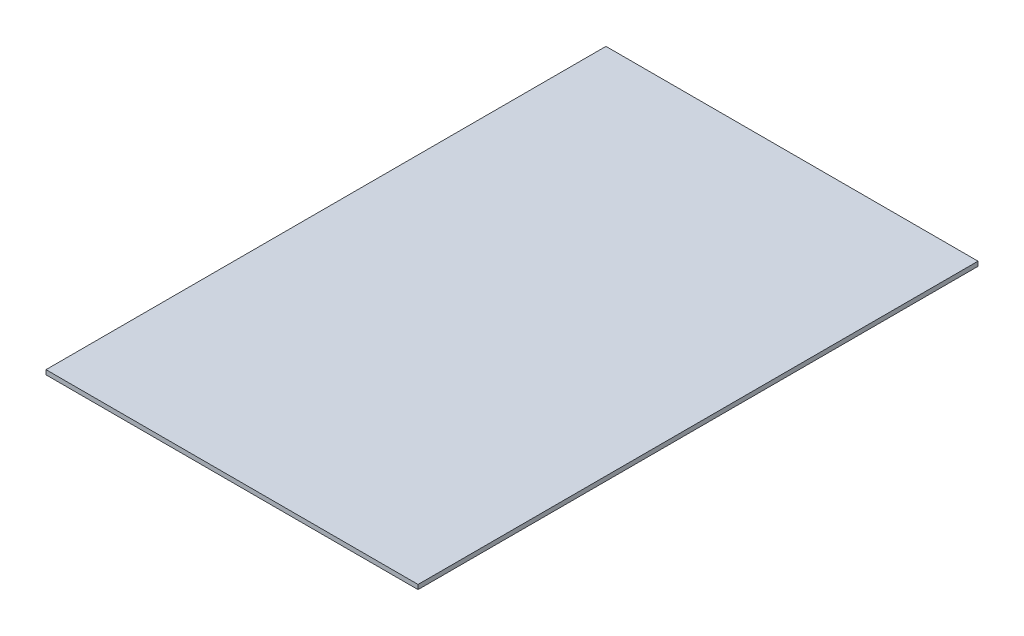
ISO-10303-21;
HEADER;
FILE_DESCRIPTION(('STEP AP214'),'2;1');
FILE_NAME('part.step','',(''),(''),'','','');
FILE_SCHEMA(('AUTOMOTIVE_DESIGN { 1 0 10303 214 1 1 1 1 }'));
ENDSEC;
DATA;
#1=APPLICATION_CONTEXT('core data for automotive mechanical design processes');
#2=APPLICATION_PROTOCOL_DEFINITION('international standard','automotive_design',2000,#1);
#3=PRODUCT_CONTEXT('',#1,'mechanical');
#4=PRODUCT('Part','Part','',(#3));
#5=PRODUCT_RELATED_PRODUCT_CATEGORY('part','',(#4));
#6=PRODUCT_DEFINITION_FORMATION('','',#4);
#7=PRODUCT_DEFINITION_CONTEXT('part definition',#1,'design');
#8=PRODUCT_DEFINITION('design','',#6,#7);
#9=PRODUCT_DEFINITION_SHAPE('','',#8);
#10=(LENGTH_UNIT() NAMED_UNIT(*) SI_UNIT(.MILLI.,.METRE.));
#11=(NAMED_UNIT(*) PLANE_ANGLE_UNIT() SI_UNIT($,.RADIAN.));
#12=(NAMED_UNIT(*) SI_UNIT($,.STERADIAN.) SOLID_ANGLE_UNIT());
#13=UNCERTAINTY_MEASURE_WITH_UNIT(LENGTH_MEASURE(1.E-05),#10,'distance_accuracy_value','');
#14=(GEOMETRIC_REPRESENTATION_CONTEXT(3) GLOBAL_UNCERTAINTY_ASSIGNED_CONTEXT((#13)) GLOBAL_UNIT_ASSIGNED_CONTEXT((#10,
#11,#12)) REPRESENTATION_CONTEXT('',''));
#15=CARTESIAN_POINT('',(0.,0.,0.));
#16=DIRECTION('',(0.,0.,1.));
#17=DIRECTION('',(1.,0.,0.));
#18=AXIS2_PLACEMENT_3D('',#15,#16,#17);
#19=CARTESIAN_POINT('',(99.,2.4,-149.));
#20=DIRECTION('',(-1.,0.,0.));
#21=DIRECTION('',(0.,0.,1.));
#22=AXIS2_PLACEMENT_3D('',#19,#20,#21);
#23=PLANE('',#22);
#24=DIRECTION('',(0.,0.,-1.));
#25=VECTOR('',#24,1.);
#26=CARTESIAN_POINT('',(99.,0.,-149.));
#27=LINE('',#26,#25);
#28=CARTESIAN_POINT('',(99.,0.,149.));
#29=VERTEX_POINT('',#28);
#30=CARTESIAN_POINT('',(99.,0.,-149.));
#31=VERTEX_POINT('',#30);
#32=EDGE_CURVE('E96',#29,#31,#27,.T.);
#33=ORIENTED_EDGE('',*,*,#32,.T.);
#34=DIRECTION('',(0.,-1.,0.));
#35=VECTOR('',#34,1.);
#36=CARTESIAN_POINT('',(99.,2.4,-149.));
#37=LINE('',#36,#35);
#38=CARTESIAN_POINT('',(99.,2.4,-149.));
#39=VERTEX_POINT('',#38);
#40=EDGE_CURVE('E11',#39,#31,#37,.T.);
#41=ORIENTED_EDGE('',*,*,#40,.F.);
#42=DIRECTION('',(0.,0.,-1.));
#43=VECTOR('',#42,1.);
#44=CARTESIAN_POINT('',(99.,2.4,-149.));
#45=LINE('',#44,#43);
#46=CARTESIAN_POINT('',(99.,2.4,149.));
#47=VERTEX_POINT('',#46);
#48=EDGE_CURVE('E84',#47,#39,#45,.T.);
#49=ORIENTED_EDGE('',*,*,#48,.F.);
#50=DIRECTION('',(0.,-1.,0.));
#51=VECTOR('',#50,1.);
#52=CARTESIAN_POINT('',(99.,2.4,149.));
#53=LINE('',#52,#51);
#54=EDGE_CURVE('E92',#47,#29,#53,.T.);
#55=ORIENTED_EDGE('',*,*,#54,.T.);
#56=EDGE_LOOP('',(#33,#41,#49,#55));
#57=FACE_BOUND('',#56,.T.);
#58=ADVANCED_FACE('F33',(#57),#23,.F.);
#59=CARTESIAN_POINT('',(-99.,2.4,-149.));
#60=DIRECTION('',(0.,0.,1.));
#61=DIRECTION('',(1.,0.,0.));
#62=AXIS2_PLACEMENT_3D('',#59,#60,#61);
#63=PLANE('',#62);
#64=DIRECTION('',(-1.,0.,0.));
#65=VECTOR('',#64,1.);
#66=CARTESIAN_POINT('',(-99.,0.,-149.));
#67=LINE('',#66,#65);
#68=CARTESIAN_POINT('',(-99.,0.,-149.));
#69=VERTEX_POINT('',#68);
#70=EDGE_CURVE('E88',#31,#69,#67,.T.);
#71=ORIENTED_EDGE('',*,*,#70,.T.);
#72=DIRECTION('',(0.,-1.,0.));
#73=VECTOR('',#72,1.);
#74=CARTESIAN_POINT('',(-99.,2.4,-149.));
#75=LINE('',#74,#73);
#76=CARTESIAN_POINT('',(-99.,2.4,-149.));
#77=VERTEX_POINT('',#76);
#78=EDGE_CURVE('E41',#77,#69,#75,.T.);
#79=ORIENTED_EDGE('',*,*,#78,.F.);
#80=DIRECTION('',(-1.,0.,0.));
#81=VECTOR('',#80,1.);
#82=CARTESIAN_POINT('',(-99.,2.4,-149.));
#83=LINE('',#82,#81);
#84=EDGE_CURVE('E79',#39,#77,#83,.T.);
#85=ORIENTED_EDGE('',*,*,#84,.F.);
#86=ORIENTED_EDGE('',*,*,#40,.T.);
#87=EDGE_LOOP('',(#71,#79,#85,#86));
#88=FACE_BOUND('',#87,.T.);
#89=ADVANCED_FACE('F87',(#88),#63,.F.);
#90=CARTESIAN_POINT('',(-99.,2.4,-149.));
#91=DIRECTION('',(1.,0.,0.));
#92=DIRECTION('',(0.,0.,-1.));
#93=AXIS2_PLACEMENT_3D('',#90,#91,#92);
#94=PLANE('',#93);
#95=DIRECTION('',(0.,0.,1.));
#96=VECTOR('',#95,1.);
#97=CARTESIAN_POINT('',(-99.,0.,-149.));
#98=LINE('',#97,#96);
#99=CARTESIAN_POINT('',(-99.,0.,149.));
#100=VERTEX_POINT('',#99);
#101=EDGE_CURVE('E66',#69,#100,#98,.T.);
#102=ORIENTED_EDGE('',*,*,#101,.T.);
#103=DIRECTION('',(0.,-1.,0.));
#104=VECTOR('',#103,1.);
#105=CARTESIAN_POINT('',(-99.,2.4,149.));
#106=LINE('',#105,#104);
#107=CARTESIAN_POINT('',(-99.,2.4,149.));
#108=VERTEX_POINT('',#107);
#109=EDGE_CURVE('E89',#108,#100,#106,.T.);
#110=ORIENTED_EDGE('',*,*,#109,.F.);
#111=DIRECTION('',(0.,0.,1.));
#112=VECTOR('',#111,1.);
#113=CARTESIAN_POINT('',(-99.,2.4,-149.));
#114=LINE('',#113,#112);
#115=EDGE_CURVE('E82',#77,#108,#114,.T.);
#116=ORIENTED_EDGE('',*,*,#115,.F.);
#117=ORIENTED_EDGE('',*,*,#78,.T.);
#118=EDGE_LOOP('',(#102,#110,#116,#117));
#119=FACE_BOUND('',#118,.T.);
#120=ADVANCED_FACE('F90',(#119),#94,.F.);
#121=CARTESIAN_POINT('',(-99.,2.4,149.));
#122=DIRECTION('',(0.,0.,-1.));
#123=DIRECTION('',(-1.,0.,0.));
#124=AXIS2_PLACEMENT_3D('',#121,#122,#123);
#125=PLANE('',#124);
#126=DIRECTION('',(1.,0.,0.));
#127=VECTOR('',#126,1.);
#128=CARTESIAN_POINT('',(-99.,0.,149.));
#129=LINE('',#128,#127);
#130=EDGE_CURVE('E72',#100,#29,#129,.T.);
#131=ORIENTED_EDGE('',*,*,#130,.T.);
#132=ORIENTED_EDGE('',*,*,#54,.F.);
#133=DIRECTION('',(1.,0.,0.));
#134=VECTOR('',#133,1.);
#135=CARTESIAN_POINT('',(-99.,2.4,149.));
#136=LINE('',#135,#134);
#137=EDGE_CURVE('E49',#108,#47,#136,.T.);
#138=ORIENTED_EDGE('',*,*,#137,.F.);
#139=ORIENTED_EDGE('',*,*,#109,.T.);
#140=EDGE_LOOP('',(#131,#132,#138,#139));
#141=FACE_BOUND('',#140,.T.);
#142=ADVANCED_FACE('F103',(#141),#125,.F.);
#143=CARTESIAN_POINT('',(0.,2.4,0.));
#144=DIRECTION('',(0.,1.,0.));
#145=DIRECTION('',(0.,0.,1.));
#146=AXIS2_PLACEMENT_3D('',#143,#144,#145);
#147=PLANE('',#146);
#148=ORIENTED_EDGE('',*,*,#48,.T.);
#149=ORIENTED_EDGE('',*,*,#84,.T.);
#150=ORIENTED_EDGE('',*,*,#115,.T.);
#151=ORIENTED_EDGE('',*,*,#137,.T.);
#152=EDGE_LOOP('',(#148,#149,#150,#151));
#153=FACE_BOUND('',#152,.T.);
#154=ADVANCED_FACE('F80',(#153),#147,.T.);
#155=CARTESIAN_POINT('',(0.,0.,0.));
#156=DIRECTION('',(0.,1.,0.));
#157=DIRECTION('',(0.,0.,1.));
#158=AXIS2_PLACEMENT_3D('',#155,#156,#157);
#159=PLANE('',#158);
#160=ORIENTED_EDGE('',*,*,#32,.F.);
#161=ORIENTED_EDGE('',*,*,#130,.F.);
#162=ORIENTED_EDGE('',*,*,#101,.F.);
#163=ORIENTED_EDGE('',*,*,#70,.F.);
#164=EDGE_LOOP('',(#160,#161,#162,#163));
#165=FACE_BOUND('',#164,.T.);
#166=ADVANCED_FACE('F106',(#165),#159,.F.);
#167=CLOSED_SHELL('',(#58,#89,#120,#142,#154,#166));
#168=MANIFOLD_SOLID_BREP('B2',#167);
#169=ADVANCED_BREP_SHAPE_REPRESENTATION('',(#18,#168),#14);
#170=SHAPE_DEFINITION_REPRESENTATION(#9,#169);
ENDSEC;
END-ISO-10303-21;
